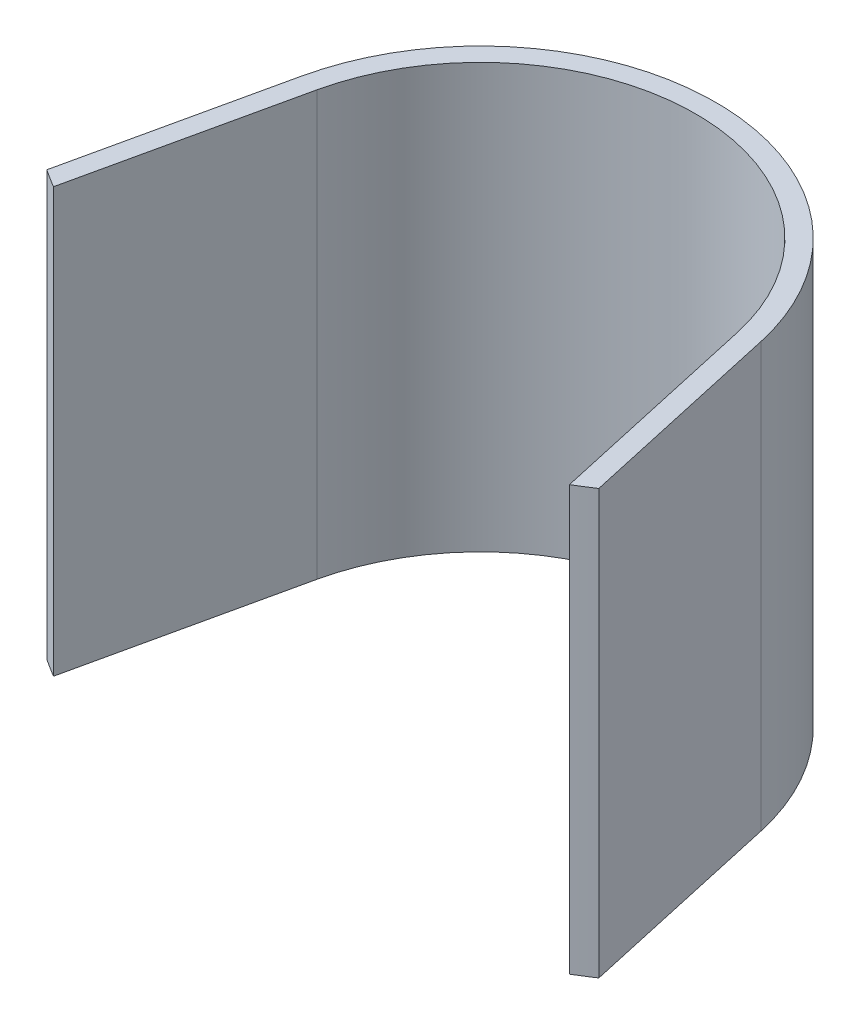
ISO-10303-21;
HEADER;
FILE_DESCRIPTION(('STEP AP214'),'2;1');
FILE_NAME('part.step','',(''),(''),'','','');
FILE_SCHEMA(('AUTOMOTIVE_DESIGN { 1 0 10303 214 1 1 1 1 }'));
ENDSEC;
DATA;
#1=APPLICATION_CONTEXT('core data for automotive mechanical design processes');
#2=APPLICATION_PROTOCOL_DEFINITION('international standard','automotive_design',2000,#1);
#3=PRODUCT_CONTEXT('',#1,'mechanical');
#4=PRODUCT('Part','Part','',(#3));
#5=PRODUCT_RELATED_PRODUCT_CATEGORY('part','',(#4));
#6=PRODUCT_DEFINITION_FORMATION('','',#4);
#7=PRODUCT_DEFINITION_CONTEXT('part definition',#1,'design');
#8=PRODUCT_DEFINITION('design','',#6,#7);
#9=PRODUCT_DEFINITION_SHAPE('','',#8);
#10=(LENGTH_UNIT() NAMED_UNIT(*) SI_UNIT(.MILLI.,.METRE.));
#11=(NAMED_UNIT(*) PLANE_ANGLE_UNIT() SI_UNIT($,.RADIAN.));
#12=(NAMED_UNIT(*) SI_UNIT($,.STERADIAN.) SOLID_ANGLE_UNIT());
#13=UNCERTAINTY_MEASURE_WITH_UNIT(LENGTH_MEASURE(1.E-05),#10,'distance_accuracy_value','');
#14=(GEOMETRIC_REPRESENTATION_CONTEXT(3) GLOBAL_UNCERTAINTY_ASSIGNED_CONTEXT((#13)) GLOBAL_UNIT_ASSIGNED_CONTEXT((#10,
#11,#12)) REPRESENTATION_CONTEXT('',''));
#15=CARTESIAN_POINT('',(0.,0.,0.));
#16=DIRECTION('',(0.,0.,1.));
#17=DIRECTION('',(1.,0.,0.));
#18=AXIS2_PLACEMENT_3D('',#15,#16,#17);
#19=CARTESIAN_POINT('',(0.,177.,285.142286340599));
#20=DIRECTION('',(0.,-1.,0.));
#21=DIRECTION('',(0.,0.,-1.));
#22=AXIS2_PLACEMENT_3D('',#19,#20,#21);
#23=CYLINDRICAL_SURFACE('',#22,64.5);
#24=CARTESIAN_POINT('',(0.,50.,285.142286340599));
#25=DIRECTION('',(0.,-1.,0.));
#26=DIRECTION('',(0.,0.,1.));
#27=AXIS2_PLACEMENT_3D('',#24,#25,#26);
#28=CIRCLE('',#27,64.5);
#29=CARTESIAN_POINT('',(-62.9710924592357,50.,271.181931241592));
#30=VERTEX_POINT('',#29);
#31=CARTESIAN_POINT('',(62.9710924592357,50.,271.181931241592));
#32=VERTEX_POINT('',#31);
#33=EDGE_CURVE('E146',#30,#32,#28,.T.);
#34=ORIENTED_EDGE('',*,*,#33,.T.);
#35=DIRECTION('',(0.,-1.,0.));
#36=VECTOR('',#35,1.);
#37=CARTESIAN_POINT('',(62.9710924592357,177.,271.181931241592));
#38=LINE('',#37,#36);
#39=CARTESIAN_POINT('',(62.9710924592357,177.,271.181931241592));
#40=VERTEX_POINT('',#39);
#41=EDGE_CURVE('E11',#40,#32,#38,.T.);
#42=ORIENTED_EDGE('',*,*,#41,.F.);
#43=CARTESIAN_POINT('',(0.,177.,285.142286340599));
#44=DIRECTION('',(0.,-1.,0.));
#45=DIRECTION('',(0.,0.,1.));
#46=AXIS2_PLACEMENT_3D('',#43,#44,#45);
#47=CIRCLE('',#46,64.5);
#48=CARTESIAN_POINT('',(-62.9710924592357,177.,271.181931241592));
#49=VERTEX_POINT('',#48);
#50=EDGE_CURVE('E168',#49,#40,#47,.T.);
#51=ORIENTED_EDGE('',*,*,#50,.F.);
#52=DIRECTION('',(0.,-1.,0.));
#53=VECTOR('',#52,1.);
#54=CARTESIAN_POINT('',(-62.9710924592357,177.,271.181931241592));
#55=LINE('',#54,#53);
#56=EDGE_CURVE('E142',#49,#30,#55,.T.);
#57=ORIENTED_EDGE('',*,*,#56,.T.);
#58=EDGE_LOOP('',(#34,#42,#51,#57));
#59=FACE_BOUND('',#58,.T.);
#60=ADVANCED_FACE('F45',(#59),#23,.F.);
#61=CARTESIAN_POINT('',(62.9710924592357,177.,271.181931241592));
#62=DIRECTION('',(0.976296007119934,0.,-0.216439613938101));
#63=DIRECTION('',(-0.216439613938101,0.,-0.976296007119934));
#64=AXIS2_PLACEMENT_3D('',#61,#62,#63);
#65=PLANE('',#64);
#66=DIRECTION('',(0.216439613938101,0.,0.976296007119934));
#67=VECTOR('',#66,1.);
#68=CARTESIAN_POINT('',(62.9710924592357,50.,271.181931241592));
#69=LINE('',#68,#67);
#70=CARTESIAN_POINT('',(77.2868968316765,50.,335.756351761124));
#71=VERTEX_POINT('',#70);
#72=EDGE_CURVE('E150',#32,#71,#69,.T.);
#73=ORIENTED_EDGE('',*,*,#72,.T.);
#74=DIRECTION('',(0.,-1.,0.));
#75=VECTOR('',#74,1.);
#76=CARTESIAN_POINT('',(77.2868968316765,177.,335.756351761124));
#77=LINE('',#76,#75);
#78=CARTESIAN_POINT('',(77.2868968316765,177.,335.756351761124));
#79=VERTEX_POINT('',#78);
#80=EDGE_CURVE('E54',#79,#71,#77,.T.);
#81=ORIENTED_EDGE('',*,*,#80,.F.);
#82=DIRECTION('',(0.216439613938101,0.,0.976296007119934));
#83=VECTOR('',#82,1.);
#84=CARTESIAN_POINT('',(62.9710924592357,177.,271.181931241592));
#85=LINE('',#84,#83);
#86=EDGE_CURVE('E105',#40,#79,#85,.T.);
#87=ORIENTED_EDGE('',*,*,#86,.F.);
#88=ORIENTED_EDGE('',*,*,#41,.T.);
#89=EDGE_LOOP('',(#73,#81,#87,#88));
#90=FACE_BOUND('',#89,.T.);
#91=ADVANCED_FACE('F214',(#90),#65,.F.);
#92=CARTESIAN_POINT('',(0.,177.,207.2));
#93=DIRECTION('',(0.,-1.,0.));
#94=DIRECTION('',(0.,0.,-1.));
#95=AXIS2_PLACEMENT_3D('',#92,#93,#94);
#96=CYLINDRICAL_SURFACE('',#95,150.);
#97=CARTESIAN_POINT('',(0.,50.,207.2));
#98=DIRECTION('',(0.,1.,0.));
#99=DIRECTION('',(0.,0.,1.));
#100=AXIS2_PLACEMENT_3D('',#97,#98,#99);
#101=CIRCLE('',#100,150.);
#102=CARTESIAN_POINT('',(82.6788905918875,50.,332.356705974928));
#103=VERTEX_POINT('',#102);
#104=EDGE_CURVE('E153',#71,#103,#101,.T.);
#105=ORIENTED_EDGE('',*,*,#104,.T.);
#106=DIRECTION('',(0.,-1.,0.));
#107=VECTOR('',#106,1.);
#108=CARTESIAN_POINT('',(82.6788905918875,177.,332.356705974928));
#109=LINE('',#108,#107);
#110=CARTESIAN_POINT('',(82.6788905918875,177.,332.356705974928));
#111=VERTEX_POINT('',#110);
#112=EDGE_CURVE('E179',#111,#103,#109,.T.);
#113=ORIENTED_EDGE('',*,*,#112,.F.);
#114=CARTESIAN_POINT('',(0.,177.,207.2));
#115=DIRECTION('',(0.,1.,0.));
#116=DIRECTION('',(0.,0.,1.));
#117=AXIS2_PLACEMENT_3D('',#114,#115,#116);
#118=CIRCLE('',#117,150.);
#119=EDGE_CURVE('E189',#79,#111,#118,.T.);
#120=ORIENTED_EDGE('',*,*,#119,.F.);
#121=ORIENTED_EDGE('',*,*,#80,.T.);
#122=EDGE_LOOP('',(#105,#113,#120,#121));
#123=FACE_BOUND('',#122,.T.);
#124=ADVANCED_FACE('F187',(#123),#96,.T.);
#125=CARTESIAN_POINT('',(68.8288685019553,177.,269.883293557963));
#126=DIRECTION('',(-0.976296007119934,0.,0.2164396139381));
#127=DIRECTION('',(0.2164396139381,0.,0.976296007119934));
#128=AXIS2_PLACEMENT_3D('',#125,#126,#127);
#129=PLANE('',#128);
#130=DIRECTION('',(-0.2164396139381,0.,-0.976296007119934));
#131=VECTOR('',#130,1.);
#132=CARTESIAN_POINT('',(68.8288685019553,50.,269.883293557963));
#133=LINE('',#132,#131);
#134=CARTESIAN_POINT('',(68.8288685019553,50.,269.883293557963));
#135=VERTEX_POINT('',#134);
#136=EDGE_CURVE('E156',#103,#135,#133,.T.);
#137=ORIENTED_EDGE('',*,*,#136,.T.);
#138=DIRECTION('',(0.,-1.,0.));
#139=VECTOR('',#138,1.);
#140=CARTESIAN_POINT('',(68.8288685019553,177.,269.883293557963));
#141=LINE('',#140,#139);
#142=CARTESIAN_POINT('',(68.8288685019553,177.,269.883293557963));
#143=VERTEX_POINT('',#142);
#144=EDGE_CURVE('E175',#143,#135,#141,.T.);
#145=ORIENTED_EDGE('',*,*,#144,.F.);
#146=DIRECTION('',(-0.2164396139381,0.,-0.976296007119934));
#147=VECTOR('',#146,1.);
#148=CARTESIAN_POINT('',(68.8288685019553,177.,269.883293557963));
#149=LINE('',#148,#147);
#150=EDGE_CURVE('E202',#111,#143,#149,.T.);
#151=ORIENTED_EDGE('',*,*,#150,.F.);
#152=ORIENTED_EDGE('',*,*,#112,.T.);
#153=EDGE_LOOP('',(#137,#145,#151,#152));
#154=FACE_BOUND('',#153,.T.);
#155=ADVANCED_FACE('F197',(#154),#129,.F.);
#156=CARTESIAN_POINT('',(0.,177.,285.142286340599));
#157=DIRECTION('',(0.,-1.,0.));
#158=DIRECTION('',(0.,0.,-1.));
#159=AXIS2_PLACEMENT_3D('',#156,#157,#158);
#160=CYLINDRICAL_SURFACE('',#159,70.5);
#161=CARTESIAN_POINT('',(0.,50.,285.142286340599));
#162=DIRECTION('',(0.,1.,0.));
#163=DIRECTION('',(0.,0.,1.));
#164=AXIS2_PLACEMENT_3D('',#161,#162,#163);
#165=CIRCLE('',#164,70.5);
#166=CARTESIAN_POINT('',(-68.8288685019553,50.,269.883293557963));
#167=VERTEX_POINT('',#166);
#168=EDGE_CURVE('E159',#135,#167,#165,.T.);
#169=ORIENTED_EDGE('',*,*,#168,.T.);
#170=DIRECTION('',(0.,-1.,0.));
#171=VECTOR('',#170,1.);
#172=CARTESIAN_POINT('',(-68.8288685019553,177.,269.883293557963));
#173=LINE('',#172,#171);
#174=CARTESIAN_POINT('',(-68.8288685019553,177.,269.883293557963));
#175=VERTEX_POINT('',#174);
#176=EDGE_CURVE('E135',#175,#167,#173,.T.);
#177=ORIENTED_EDGE('',*,*,#176,.F.);
#178=CARTESIAN_POINT('',(0.,177.,285.142286340599));
#179=DIRECTION('',(0.,1.,0.));
#180=DIRECTION('',(0.,0.,1.));
#181=AXIS2_PLACEMENT_3D('',#178,#179,#180);
#182=CIRCLE('',#181,70.5);
#183=EDGE_CURVE('E124',#143,#175,#182,.T.);
#184=ORIENTED_EDGE('',*,*,#183,.F.);
#185=ORIENTED_EDGE('',*,*,#144,.T.);
#186=EDGE_LOOP('',(#169,#177,#184,#185));
#187=FACE_BOUND('',#186,.T.);
#188=ADVANCED_FACE('F200',(#187),#160,.T.);
#189=CARTESIAN_POINT('',(-68.8288685019553,177.,269.883293557963));
#190=DIRECTION('',(0.976296007119934,0.,0.216439613938099));
#191=DIRECTION('',(0.216439613938099,0.,-0.976296007119934));
#192=AXIS2_PLACEMENT_3D('',#189,#190,#191);
#193=PLANE('',#192);
#194=DIRECTION('',(-0.216439613938099,0.,0.976296007119934));
#195=VECTOR('',#194,1.);
#196=CARTESIAN_POINT('',(-68.8288685019553,50.,269.883293557963));
#197=LINE('',#196,#195);
#198=CARTESIAN_POINT('',(-82.6788905918874,50.,332.356705974929));
#199=VERTEX_POINT('',#198);
#200=EDGE_CURVE('E133',#167,#199,#197,.T.);
#201=ORIENTED_EDGE('',*,*,#200,.T.);
#202=DIRECTION('',(0.,-1.,0.));
#203=VECTOR('',#202,1.);
#204=CARTESIAN_POINT('',(-82.6788905918874,177.,332.356705974929));
#205=LINE('',#204,#203);
#206=CARTESIAN_POINT('',(-82.6788905918874,177.,332.356705974929));
#207=VERTEX_POINT('',#206);
#208=EDGE_CURVE('E130',#207,#199,#205,.T.);
#209=ORIENTED_EDGE('',*,*,#208,.F.);
#210=DIRECTION('',(-0.216439613938099,0.,0.976296007119934));
#211=VECTOR('',#210,1.);
#212=CARTESIAN_POINT('',(-68.8288685019553,177.,269.883293557963));
#213=LINE('',#212,#211);
#214=EDGE_CURVE('E118',#175,#207,#213,.T.);
#215=ORIENTED_EDGE('',*,*,#214,.F.);
#216=ORIENTED_EDGE('',*,*,#176,.T.);
#217=EDGE_LOOP('',(#201,#209,#215,#216));
#218=FACE_BOUND('',#217,.T.);
#219=ADVANCED_FACE('F131',(#218),#193,.F.);
#220=CARTESIAN_POINT('',(0.,177.,207.2));
#221=DIRECTION('',(0.,-1.,0.));
#222=DIRECTION('',(0.,0.,-1.));
#223=AXIS2_PLACEMENT_3D('',#220,#221,#222);
#224=CYLINDRICAL_SURFACE('',#223,150.);
#225=CARTESIAN_POINT('',(0.,50.,207.2));
#226=DIRECTION('',(0.,1.,0.));
#227=DIRECTION('',(0.,0.,1.));
#228=AXIS2_PLACEMENT_3D('',#225,#226,#227);
#229=CIRCLE('',#228,150.);
#230=CARTESIAN_POINT('',(-77.2868968316764,50.,335.756351761124));
#231=VERTEX_POINT('',#230);
#232=EDGE_CURVE('E91',#199,#231,#229,.T.);
#233=ORIENTED_EDGE('',*,*,#232,.T.);
#234=DIRECTION('',(0.,-1.,0.));
#235=VECTOR('',#234,1.);
#236=CARTESIAN_POINT('',(-77.2868968316764,177.,335.756351761124));
#237=LINE('',#236,#235);
#238=CARTESIAN_POINT('',(-77.2868968316764,177.,335.756351761124));
#239=VERTEX_POINT('',#238);
#240=EDGE_CURVE('E136',#239,#231,#237,.T.);
#241=ORIENTED_EDGE('',*,*,#240,.F.);
#242=CARTESIAN_POINT('',(0.,177.,207.2));
#243=DIRECTION('',(0.,1.,0.));
#244=DIRECTION('',(0.,0.,1.));
#245=AXIS2_PLACEMENT_3D('',#242,#243,#244);
#246=CIRCLE('',#245,150.);
#247=EDGE_CURVE('E122',#207,#239,#246,.T.);
#248=ORIENTED_EDGE('',*,*,#247,.F.);
#249=ORIENTED_EDGE('',*,*,#208,.T.);
#250=EDGE_LOOP('',(#233,#241,#248,#249));
#251=FACE_BOUND('',#250,.T.);
#252=ADVANCED_FACE('F138',(#251),#224,.T.);
#253=CARTESIAN_POINT('',(-62.9710924592357,177.,271.181931241592));
#254=DIRECTION('',(-0.976296007119934,0.,-0.216439613938099));
#255=DIRECTION('',(-0.216439613938099,0.,0.976296007119934));
#256=AXIS2_PLACEMENT_3D('',#253,#254,#255);
#257=PLANE('',#256);
#258=DIRECTION('',(0.216439613938099,0.,-0.976296007119934));
#259=VECTOR('',#258,1.);
#260=CARTESIAN_POINT('',(-62.9710924592357,50.,271.181931241592));
#261=LINE('',#260,#259);
#262=EDGE_CURVE('E97',#231,#30,#261,.T.);
#263=ORIENTED_EDGE('',*,*,#262,.T.);
#264=ORIENTED_EDGE('',*,*,#56,.F.);
#265=DIRECTION('',(0.216439613938099,0.,-0.976296007119934));
#266=VECTOR('',#265,1.);
#267=CARTESIAN_POINT('',(-62.9710924592357,177.,271.181931241592));
#268=LINE('',#267,#266);
#269=EDGE_CURVE('E62',#239,#49,#268,.T.);
#270=ORIENTED_EDGE('',*,*,#269,.F.);
#271=ORIENTED_EDGE('',*,*,#240,.T.);
#272=EDGE_LOOP('',(#263,#264,#270,#271));
#273=FACE_BOUND('',#272,.T.);
#274=ADVANCED_FACE('F230',(#273),#257,.F.);
#275=CARTESIAN_POINT('',(0.,177.,285.142286340599));
#276=DIRECTION('',(0.,1.,0.));
#277=DIRECTION('',(0.,0.,1.));
#278=AXIS2_PLACEMENT_3D('',#275,#276,#277);
#279=PLANE('',#278);
#280=ORIENTED_EDGE('',*,*,#50,.T.);
#281=ORIENTED_EDGE('',*,*,#86,.T.);
#282=ORIENTED_EDGE('',*,*,#119,.T.);
#283=ORIENTED_EDGE('',*,*,#150,.T.);
#284=ORIENTED_EDGE('',*,*,#183,.T.);
#285=ORIENTED_EDGE('',*,*,#214,.T.);
#286=ORIENTED_EDGE('',*,*,#247,.T.);
#287=ORIENTED_EDGE('',*,*,#269,.T.);
#288=EDGE_LOOP('',(#280,#281,#282,#283,#284,#285,#286,#287));
#289=FACE_BOUND('',#288,.T.);
#290=ADVANCED_FACE('F120',(#289),#279,.T.);
#291=CARTESIAN_POINT('',(0.,50.,285.142286340599));
#292=DIRECTION('',(0.,1.,0.));
#293=DIRECTION('',(0.,0.,1.));
#294=AXIS2_PLACEMENT_3D('',#291,#292,#293);
#295=PLANE('',#294);
#296=ORIENTED_EDGE('',*,*,#33,.F.);
#297=ORIENTED_EDGE('',*,*,#262,.F.);
#298=ORIENTED_EDGE('',*,*,#232,.F.);
#299=ORIENTED_EDGE('',*,*,#200,.F.);
#300=ORIENTED_EDGE('',*,*,#168,.F.);
#301=ORIENTED_EDGE('',*,*,#136,.F.);
#302=ORIENTED_EDGE('',*,*,#104,.F.);
#303=ORIENTED_EDGE('',*,*,#72,.F.);
#304=EDGE_LOOP('',(#296,#297,#298,#299,#300,#301,#302,#303));
#305=FACE_BOUND('',#304,.T.);
#306=ADVANCED_FACE('F193',(#305),#295,.F.);
#307=CLOSED_SHELL('',(#60,#91,#124,#155,#188,#219,#252,#274,#290,#306));
#308=MANIFOLD_SOLID_BREP('B2',#307);
#309=ADVANCED_BREP_SHAPE_REPRESENTATION('',(#18,#308),#14);
#310=SHAPE_DEFINITION_REPRESENTATION(#9,#309);
ENDSEC;
END-ISO-10303-21;
